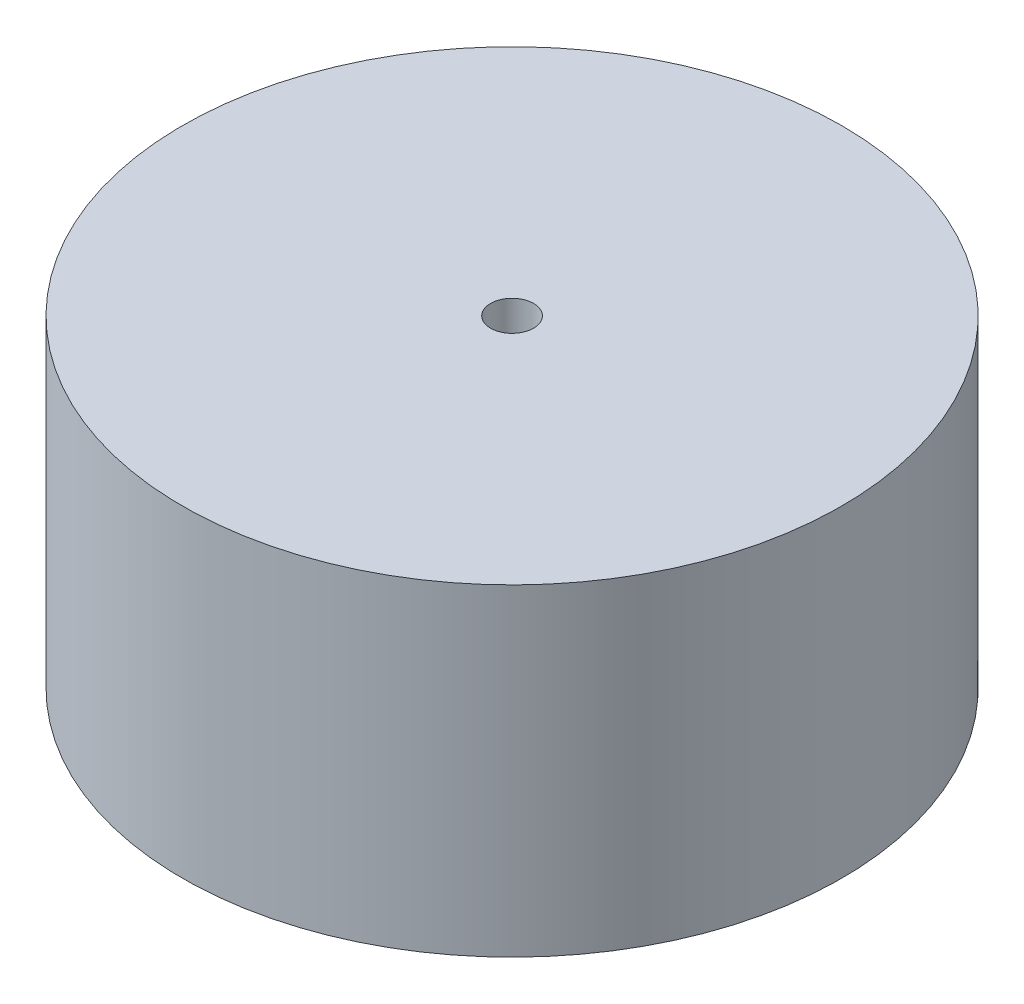
ISO-10303-21;
HEADER;
FILE_DESCRIPTION(('STEP AP214'),'2;1');
FILE_NAME('part.step','',(''),(''),'','','');
FILE_SCHEMA(('AUTOMOTIVE_DESIGN { 1 0 10303 214 1 1 1 1 }'));
ENDSEC;
DATA;
#1=APPLICATION_CONTEXT('core data for automotive mechanical design processes');
#2=APPLICATION_PROTOCOL_DEFINITION('international standard','automotive_design',2000,#1);
#3=PRODUCT_CONTEXT('',#1,'mechanical');
#4=PRODUCT('Part','Part','',(#3));
#5=PRODUCT_RELATED_PRODUCT_CATEGORY('part','',(#4));
#6=PRODUCT_DEFINITION_FORMATION('','',#4);
#7=PRODUCT_DEFINITION_CONTEXT('part definition',#1,'design');
#8=PRODUCT_DEFINITION('design','',#6,#7);
#9=PRODUCT_DEFINITION_SHAPE('','',#8);
#10=(LENGTH_UNIT() NAMED_UNIT(*) SI_UNIT(.MILLI.,.METRE.));
#11=(NAMED_UNIT(*) PLANE_ANGLE_UNIT() SI_UNIT($,.RADIAN.));
#12=(NAMED_UNIT(*) SI_UNIT($,.STERADIAN.) SOLID_ANGLE_UNIT());
#13=UNCERTAINTY_MEASURE_WITH_UNIT(LENGTH_MEASURE(1.E-05),#10,'distance_accuracy_value','');
#14=(GEOMETRIC_REPRESENTATION_CONTEXT(3) GLOBAL_UNCERTAINTY_ASSIGNED_CONTEXT((#13)) GLOBAL_UNIT_ASSIGNED_CONTEXT((#10,
#11,#12)) REPRESENTATION_CONTEXT('',''));
#15=CARTESIAN_POINT('',(0.,0.,0.));
#16=DIRECTION('',(0.,0.,1.));
#17=DIRECTION('',(1.,0.,0.));
#18=AXIS2_PLACEMENT_3D('',#15,#16,#17);
#19=CARTESIAN_POINT('',(-29.7252773968515,22.5,-4.34662075142641));
#20=DIRECTION('',(0.,-1.,0.));
#21=DIRECTION('',(0.,0.,-1.));
#22=AXIS2_PLACEMENT_3D('',#19,#20,#21);
#23=CYLINDRICAL_SURFACE('',#22,23.);
#24=CARTESIAN_POINT('',(-29.7252773968515,22.5,-4.34662075142641));
#25=DIRECTION('',(0.,1.,0.));
#26=DIRECTION('',(0.,0.,1.));
#27=AXIS2_PLACEMENT_3D('',#24,#25,#26);
#28=CIRCLE('',#27,23.);
#29=CARTESIAN_POINT('',(-29.7252773968515,22.5,-27.3466207514264));
#30=VERTEX_POINT('',#29);
#31=EDGE_CURVE('E10',#30,#30,#28,.T.);
#32=CARTESIAN_POINT('',(-29.7252773968515,0.,-4.34662075142641));
#33=DIRECTION('',(0.,1.,0.));
#34=DIRECTION('',(0.,0.,1.));
#35=AXIS2_PLACEMENT_3D('',#32,#33,#34);
#36=CIRCLE('',#35,23.);
#37=CARTESIAN_POINT('',(-29.7252773968515,0.,-27.3466207514264));
#38=VERTEX_POINT('',#37);
#39=EDGE_CURVE('E40',#38,#38,#36,.T.);
#40=CARTESIAN_POINT('',(-29.7252773968515,22.5,-27.3466207514264));
#41=CARTESIAN_POINT('',(-29.7252773968515,22.265625,-27.3466207514264));
#42=CARTESIAN_POINT('',(-29.7252773968515,22.03125,-27.3466207514264));
#43=CARTESIAN_POINT('',(-29.7252773968515,21.5625,-27.3466207514264));
#44=CARTESIAN_POINT('',(-29.7252773968515,21.328125,-27.3466207514264));
#45=CARTESIAN_POINT('',(-29.7252773968515,20.859375,-27.3466207514264));
#46=CARTESIAN_POINT('',(-29.7252773968515,20.625,-27.3466207514264));
#47=CARTESIAN_POINT('',(-29.7252773968515,20.15625,-27.3466207514264));
#48=CARTESIAN_POINT('',(-29.7252773968515,19.921875,-27.3466207514264));
#49=CARTESIAN_POINT('',(-29.7252773968515,19.453125,-27.3466207514264));
#50=CARTESIAN_POINT('',(-29.7252773968515,19.21875,-27.3466207514264));
#51=CARTESIAN_POINT('',(-29.7252773968515,18.75,-27.3466207514264));
#52=CARTESIAN_POINT('',(-29.7252773968515,18.515625,-27.3466207514264));
#53=CARTESIAN_POINT('',(-29.7252773968515,18.046875,-27.3466207514264));
#54=CARTESIAN_POINT('',(-29.7252773968515,17.8125,-27.3466207514264));
#55=CARTESIAN_POINT('',(-29.7252773968515,17.34375,-27.3466207514264));
#56=CARTESIAN_POINT('',(-29.7252773968515,17.109375,-27.3466207514264));
#57=CARTESIAN_POINT('',(-29.7252773968515,16.640625,-27.3466207514264));
#58=CARTESIAN_POINT('',(-29.7252773968515,16.40625,-27.3466207514264));
#59=CARTESIAN_POINT('',(-29.7252773968515,15.9375,-27.3466207514264));
#60=CARTESIAN_POINT('',(-29.7252773968515,15.703125,-27.3466207514264));
#61=CARTESIAN_POINT('',(-29.7252773968515,15.234375,-27.3466207514264));
#62=CARTESIAN_POINT('',(-29.7252773968515,15.,-27.3466207514264));
#63=CARTESIAN_POINT('',(-29.7252773968515,14.53125,-27.3466207514264));
#64=CARTESIAN_POINT('',(-29.7252773968515,14.296875,-27.3466207514264));
#65=CARTESIAN_POINT('',(-29.7252773968515,13.828125,-27.3466207514264));
#66=CARTESIAN_POINT('',(-29.7252773968515,13.59375,-27.3466207514264));
#67=CARTESIAN_POINT('',(-29.7252773968515,13.125,-27.3466207514264));
#68=CARTESIAN_POINT('',(-29.7252773968515,12.890625,-27.3466207514264));
#69=CARTESIAN_POINT('',(-29.7252773968515,12.421875,-27.3466207514264));
#70=CARTESIAN_POINT('',(-29.7252773968515,12.1875,-27.3466207514264));
#71=CARTESIAN_POINT('',(-29.7252773968515,11.71875,-27.3466207514264));
#72=CARTESIAN_POINT('',(-29.7252773968515,11.484375,-27.3466207514264));
#73=CARTESIAN_POINT('',(-29.7252773968515,11.015625,-27.3466207514264));
#74=CARTESIAN_POINT('',(-29.7252773968515,10.78125,-27.3466207514264));
#75=CARTESIAN_POINT('',(-29.7252773968515,10.3125,-27.3466207514264));
#76=CARTESIAN_POINT('',(-29.7252773968515,10.078125,-27.3466207514264));
#77=CARTESIAN_POINT('',(-29.7252773968515,9.60937499999999,-27.3466207514264));
#78=CARTESIAN_POINT('',(-29.7252773968515,9.375,-27.3466207514264));
#79=CARTESIAN_POINT('',(-29.7252773968515,8.90625,-27.3466207514264));
#80=CARTESIAN_POINT('',(-29.7252773968515,8.671875,-27.3466207514264));
#81=CARTESIAN_POINT('',(-29.7252773968515,8.20312499999999,-27.3466207514264));
#82=CARTESIAN_POINT('',(-29.7252773968515,7.96874999999999,-27.3466207514264));
#83=CARTESIAN_POINT('',(-29.7252773968515,7.5,-27.3466207514264));
#84=CARTESIAN_POINT('',(-29.7252773968515,7.265625,-27.3466207514264));
#85=CARTESIAN_POINT('',(-29.7252773968515,6.796875,-27.3466207514264));
#86=CARTESIAN_POINT('',(-29.7252773968515,6.5625,-27.3466207514264));
#87=CARTESIAN_POINT('',(-29.7252773968515,6.09375,-27.3466207514264));
#88=CARTESIAN_POINT('',(-29.7252773968515,5.859375,-27.3466207514264));
#89=CARTESIAN_POINT('',(-29.7252773968515,5.390625,-27.3466207514264));
#90=CARTESIAN_POINT('',(-29.7252773968515,5.15625,-27.3466207514264));
#91=CARTESIAN_POINT('',(-29.7252773968515,4.6875,-27.3466207514264));
#92=CARTESIAN_POINT('',(-29.7252773968515,4.453125,-27.3466207514264));
#93=CARTESIAN_POINT('',(-29.7252773968515,3.984375,-27.3466207514264));
#94=CARTESIAN_POINT('',(-29.7252773968515,3.75,-27.3466207514264));
#95=CARTESIAN_POINT('',(-29.7252773968515,3.28125,-27.3466207514264));
#96=CARTESIAN_POINT('',(-29.7252773968515,3.046875,-27.3466207514264));
#97=CARTESIAN_POINT('',(-29.7252773968515,2.578125,-27.3466207514264));
#98=CARTESIAN_POINT('',(-29.7252773968515,2.34375,-27.3466207514264));
#99=CARTESIAN_POINT('',(-29.7252773968515,1.875,-27.3466207514264));
#100=CARTESIAN_POINT('',(-29.7252773968515,1.640625,-27.3466207514264));
#101=CARTESIAN_POINT('',(-29.7252773968515,1.171875,-27.3466207514264));
#102=CARTESIAN_POINT('',(-29.7252773968515,0.937499999999996,-27.3466207514264));
#103=CARTESIAN_POINT('',(-29.7252773968515,0.468749999999996,-27.3466207514264));
#104=CARTESIAN_POINT('',(-29.7252773968515,0.234374999999996,-27.3466207514264));
#105=CARTESIAN_POINT('',(-29.7252773968515,0.,-27.3466207514264));
#106=B_SPLINE_CURVE_WITH_KNOTS('',3,(#40,#41,#42,#43,#44,#45,#46,#47,#48,#49,#50,#51,#52,#53,
#54,#55,#56,#57,#58,#59,#60,#61,#62,#63,#64,#65,#66,#67,#68,#69,#70,#71,#72,#73,#74,#75,#76,#77,
#78,#79,#80,#81,#82,#83,#84,#85,#86,#87,#88,#89,#90,#91,#92,#93,#94,#95,#96,#97,#98,#99,#100,
#101,#102,#103,#104,#105),.UNSPECIFIED.,.F.,.F.,(4,2,2,2,2,2,2,2,2,2,2,2,2,2,2,2,2,2,2,2,2,2,2,
2,2,2,2,2,2,2,2,2,4),(0.,0.703125000000002,1.40625,2.109375,2.8125,3.515625,4.21875,4.921875,
5.625,6.328125,7.03125,7.734375,8.4375,9.140625,9.84375,10.546875,11.25,11.953125,12.65625,
13.359375,14.0625,14.765625,15.46875,16.171875,16.875,17.578125,18.28125,18.984375,19.6875,
20.390625,21.09375,21.796875,22.5),.UNSPECIFIED.);
#107=EDGE_CURVE('BSEAM37',#30,#38,#106,.T.);
#108=ORIENTED_EDGE('',*,*,#31,.F.);
#109=ORIENTED_EDGE('',*,*,#39,.T.);
#110=ORIENTED_EDGE('',*,*,#107,.T.);
#111=ORIENTED_EDGE('',*,*,#107,.F.);
#112=EDGE_LOOP('',(#108,#110,#109,#111));
#113=FACE_BOUND('',#112,.T.);
#114=ADVANCED_FACE('F37',(#113),#23,.T.);
#115=CARTESIAN_POINT('',(-29.7252773968515,22.5,-4.34662075142641));
#116=DIRECTION('',(0.,1.,0.));
#117=DIRECTION('',(0.,0.,1.));
#118=AXIS2_PLACEMENT_3D('',#115,#116,#117);
#119=PLANE('',#118);
#120=CARTESIAN_POINT('',(-29.7252773968515,22.5,-4.34662075142641));
#121=DIRECTION('',(0.,-1.,0.));
#122=DIRECTION('',(0.,0.,-1.));
#123=AXIS2_PLACEMENT_3D('',#120,#121,#122);
#124=CIRCLE('',#123,1.5);
#125=CARTESIAN_POINT('',(-29.7252773968515,22.5,-5.84662075142641));
#126=VERTEX_POINT('',#125);
#127=EDGE_CURVE('E49',#126,#126,#124,.T.);
#128=ORIENTED_EDGE('',*,*,#127,.T.);
#129=EDGE_LOOP('',(#128));
#130=FACE_BOUND('',#129,.T.);
#131=ORIENTED_EDGE('',*,*,#31,.T.);
#132=EDGE_LOOP('',(#131));
#133=FACE_BOUND('',#132,.T.);
#134=ADVANCED_FACE('F59',(#130,#133),#119,.T.);
#135=CARTESIAN_POINT('',(-29.7252773968515,0.,-4.34662075142641));
#136=DIRECTION('',(0.,1.,0.));
#137=DIRECTION('',(0.,0.,1.));
#138=AXIS2_PLACEMENT_3D('',#135,#136,#137);
#139=PLANE('',#138);
#140=CARTESIAN_POINT('',(-29.7252773968515,0.,-4.34662075142641));
#141=DIRECTION('',(0.,-1.,0.));
#142=DIRECTION('',(0.,0.,-1.));
#143=AXIS2_PLACEMENT_3D('',#140,#141,#142);
#144=CIRCLE('',#143,1.5);
#145=CARTESIAN_POINT('',(-29.7252773968515,0.,-5.84662075142641));
#146=VERTEX_POINT('',#145);
#147=EDGE_CURVE('E51',#146,#146,#144,.T.);
#148=ORIENTED_EDGE('',*,*,#147,.F.);
#149=EDGE_LOOP('',(#148));
#150=FACE_BOUND('',#149,.T.);
#151=ORIENTED_EDGE('',*,*,#39,.F.);
#152=EDGE_LOOP('',(#151));
#153=FACE_BOUND('',#152,.T.);
#154=ADVANCED_FACE('F64',(#150,#153),#139,.F.);
#155=CARTESIAN_POINT('',(-29.7252773968515,22.5,-4.34662075142641));
#156=DIRECTION('',(0.,-1.,0.));
#157=DIRECTION('',(0.,0.,-1.));
#158=AXIS2_PLACEMENT_3D('',#155,#156,#157);
#159=CYLINDRICAL_SURFACE('',#158,1.5);
#160=CARTESIAN_POINT('',(-29.7252773968515,22.5,-5.84662075142641));
#161=CARTESIAN_POINT('',(-29.7252773968515,22.265625,-5.84662075142641));
#162=CARTESIAN_POINT('',(-29.7252773968515,22.03125,-5.84662075142641));
#163=CARTESIAN_POINT('',(-29.7252773968515,21.5625,-5.84662075142641));
#164=CARTESIAN_POINT('',(-29.7252773968515,21.328125,-5.84662075142641));
#165=CARTESIAN_POINT('',(-29.7252773968515,20.859375,-5.84662075142641));
#166=CARTESIAN_POINT('',(-29.7252773968515,20.625,-5.84662075142641));
#167=CARTESIAN_POINT('',(-29.7252773968515,20.15625,-5.84662075142641));
#168=CARTESIAN_POINT('',(-29.7252773968515,19.921875,-5.84662075142641));
#169=CARTESIAN_POINT('',(-29.7252773968515,19.453125,-5.84662075142641));
#170=CARTESIAN_POINT('',(-29.7252773968515,19.21875,-5.84662075142641));
#171=CARTESIAN_POINT('',(-29.7252773968515,18.75,-5.84662075142641));
#172=CARTESIAN_POINT('',(-29.7252773968515,18.515625,-5.84662075142641));
#173=CARTESIAN_POINT('',(-29.7252773968515,18.046875,-5.84662075142641));
#174=CARTESIAN_POINT('',(-29.7252773968515,17.8125,-5.84662075142641));
#175=CARTESIAN_POINT('',(-29.7252773968515,17.34375,-5.84662075142641));
#176=CARTESIAN_POINT('',(-29.7252773968515,17.109375,-5.84662075142641));
#177=CARTESIAN_POINT('',(-29.7252773968515,16.640625,-5.84662075142641));
#178=CARTESIAN_POINT('',(-29.7252773968515,16.40625,-5.84662075142641));
#179=CARTESIAN_POINT('',(-29.7252773968515,15.9375,-5.84662075142641));
#180=CARTESIAN_POINT('',(-29.7252773968515,15.703125,-5.84662075142641));
#181=CARTESIAN_POINT('',(-29.7252773968515,15.234375,-5.84662075142641));
#182=CARTESIAN_POINT('',(-29.7252773968515,15.,-5.84662075142641));
#183=CARTESIAN_POINT('',(-29.7252773968515,14.53125,-5.84662075142641));
#184=CARTESIAN_POINT('',(-29.7252773968515,14.296875,-5.84662075142641));
#185=CARTESIAN_POINT('',(-29.7252773968515,13.828125,-5.84662075142641));
#186=CARTESIAN_POINT('',(-29.7252773968515,13.59375,-5.84662075142641));
#187=CARTESIAN_POINT('',(-29.7252773968515,13.125,-5.84662075142641));
#188=CARTESIAN_POINT('',(-29.7252773968515,12.890625,-5.84662075142641));
#189=CARTESIAN_POINT('',(-29.7252773968515,12.421875,-5.84662075142641));
#190=CARTESIAN_POINT('',(-29.7252773968515,12.1875,-5.84662075142641));
#191=CARTESIAN_POINT('',(-29.7252773968515,11.71875,-5.84662075142641));
#192=CARTESIAN_POINT('',(-29.7252773968515,11.484375,-5.84662075142641));
#193=CARTESIAN_POINT('',(-29.7252773968515,11.015625,-5.84662075142641));
#194=CARTESIAN_POINT('',(-29.7252773968515,10.78125,-5.84662075142641));
#195=CARTESIAN_POINT('',(-29.7252773968515,10.3125,-5.84662075142641));
#196=CARTESIAN_POINT('',(-29.7252773968515,10.078125,-5.84662075142641));
#197=CARTESIAN_POINT('',(-29.7252773968515,9.609375,-5.84662075142641));
#198=CARTESIAN_POINT('',(-29.7252773968515,9.375,-5.84662075142641));
#199=CARTESIAN_POINT('',(-29.7252773968515,8.90625,-5.84662075142641));
#200=CARTESIAN_POINT('',(-29.7252773968515,8.671875,-5.84662075142641));
#201=CARTESIAN_POINT('',(-29.7252773968515,8.203125,-5.84662075142641));
#202=CARTESIAN_POINT('',(-29.7252773968515,7.96875,-5.84662075142641));
#203=CARTESIAN_POINT('',(-29.7252773968515,7.5,-5.84662075142641));
#204=CARTESIAN_POINT('',(-29.7252773968515,7.265625,-5.84662075142641));
#205=CARTESIAN_POINT('',(-29.7252773968515,6.796875,-5.84662075142641));
#206=CARTESIAN_POINT('',(-29.7252773968515,6.5625,-5.84662075142641));
#207=CARTESIAN_POINT('',(-29.7252773968515,6.09375,-5.84662075142641));
#208=CARTESIAN_POINT('',(-29.7252773968515,5.859375,-5.84662075142641));
#209=CARTESIAN_POINT('',(-29.7252773968515,5.390625,-5.84662075142641));
#210=CARTESIAN_POINT('',(-29.7252773968515,5.15625,-5.84662075142641));
#211=CARTESIAN_POINT('',(-29.7252773968515,4.6875,-5.84662075142641));
#212=CARTESIAN_POINT('',(-29.7252773968515,4.453125,-5.84662075142641));
#213=CARTESIAN_POINT('',(-29.7252773968515,3.984375,-5.84662075142641));
#214=CARTESIAN_POINT('',(-29.7252773968515,3.75,-5.84662075142641));
#215=CARTESIAN_POINT('',(-29.7252773968515,3.28125,-5.84662075142641));
#216=CARTESIAN_POINT('',(-29.7252773968515,3.046875,-5.84662075142641));
#217=CARTESIAN_POINT('',(-29.7252773968515,2.578125,-5.84662075142641));
#218=CARTESIAN_POINT('',(-29.7252773968515,2.34375,-5.84662075142641));
#219=CARTESIAN_POINT('',(-29.7252773968515,1.875,-5.84662075142641));
#220=CARTESIAN_POINT('',(-29.7252773968515,1.640625,-5.84662075142641));
#221=CARTESIAN_POINT('',(-29.7252773968515,1.171875,-5.84662075142641));
#222=CARTESIAN_POINT('',(-29.7252773968515,0.937500000000003,-5.84662075142641));
#223=CARTESIAN_POINT('',(-29.7252773968515,0.468750000000003,-5.84662075142641));
#224=CARTESIAN_POINT('',(-29.7252773968515,0.234375000000003,-5.84662075142641));
#225=CARTESIAN_POINT('',(-29.7252773968515,0.,-5.84662075142641));
#226=B_SPLINE_CURVE_WITH_KNOTS('',3,(#160,#161,#162,#163,#164,#165,#166,#167,#168,#169,#170,
#171,#172,#173,#174,#175,#176,#177,#178,#179,#180,#181,#182,#183,#184,#185,#186,#187,#188,#189,
#190,#191,#192,#193,#194,#195,#196,#197,#198,#199,#200,#201,#202,#203,#204,#205,#206,#207,#208,
#209,#210,#211,#212,#213,#214,#215,#216,#217,#218,#219,#220,#221,#222,#223,#224,#225),
.UNSPECIFIED.,.F.,.F.,(4,2,2,2,2,2,2,2,2,2,2,2,2,2,2,2,2,2,2,2,2,2,2,2,2,2,2,2,2,2,2,2,4),(0.,
0.703125000000002,1.40625,2.109375,2.8125,3.515625,4.21875,4.921875,5.625,6.328125,7.03125,
7.734375,8.4375,9.140625,9.84375,10.546875,11.25,11.953125,12.65625,13.359375,14.0625,14.765625,
15.46875,16.171875,16.875,17.578125,18.28125,18.984375,19.6875,20.390625,21.09375,21.796875,
22.5),.UNSPECIFIED.);
#227=EDGE_CURVE('BSEAM61',#126,#146,#226,.T.);
#228=ORIENTED_EDGE('',*,*,#127,.F.);
#229=ORIENTED_EDGE('',*,*,#147,.T.);
#230=ORIENTED_EDGE('',*,*,#227,.T.);
#231=ORIENTED_EDGE('',*,*,#227,.F.);
#232=EDGE_LOOP('',(#228,#230,#229,#231));
#233=FACE_BOUND('',#232,.T.);
#234=ADVANCED_FACE('F61',(#233),#159,.F.);
#235=CLOSED_SHELL('',(#114,#134,#154,#234));
#236=MANIFOLD_SOLID_BREP('B2',#235);
#237=ADVANCED_BREP_SHAPE_REPRESENTATION('',(#18,#236),#14);
#238=SHAPE_DEFINITION_REPRESENTATION(#9,#237);
ENDSEC;
END-ISO-10303-21;
